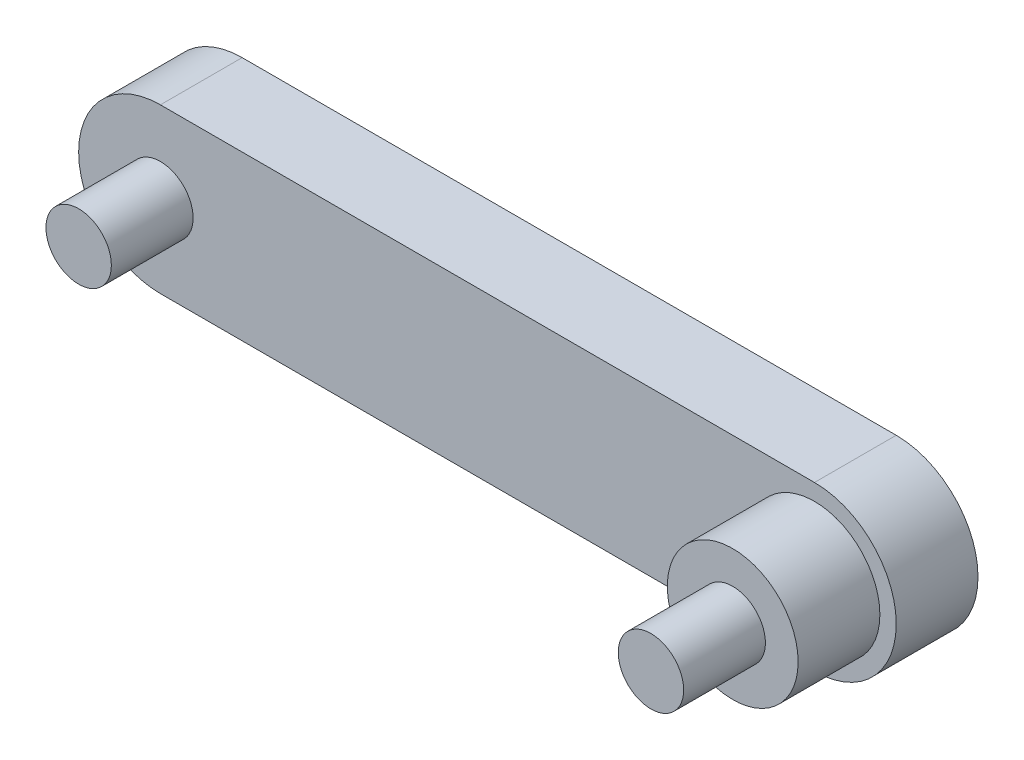
ISO-10303-21;
HEADER;
FILE_DESCRIPTION(('STEP AP214'),'2;1');
FILE_NAME('part.step','',(''),(''),'','','');
FILE_SCHEMA(('AUTOMOTIVE_DESIGN { 1 0 10303 214 1 1 1 1 }'));
ENDSEC;
DATA;
#1=APPLICATION_CONTEXT('core data for automotive mechanical design processes');
#2=APPLICATION_PROTOCOL_DEFINITION('international standard','automotive_design',2000,#1);
#3=PRODUCT_CONTEXT('',#1,'mechanical');
#4=PRODUCT('Part','Part','',(#3));
#5=PRODUCT_RELATED_PRODUCT_CATEGORY('part','',(#4));
#6=PRODUCT_DEFINITION_FORMATION('','',#4);
#7=PRODUCT_DEFINITION_CONTEXT('part definition',#1,'design');
#8=PRODUCT_DEFINITION('design','',#6,#7);
#9=PRODUCT_DEFINITION_SHAPE('','',#8);
#10=(LENGTH_UNIT() NAMED_UNIT(*) SI_UNIT(.MILLI.,.METRE.));
#11=(NAMED_UNIT(*) PLANE_ANGLE_UNIT() SI_UNIT($,.RADIAN.));
#12=(NAMED_UNIT(*) SI_UNIT($,.STERADIAN.) SOLID_ANGLE_UNIT());
#13=UNCERTAINTY_MEASURE_WITH_UNIT(LENGTH_MEASURE(1.E-05),#10,'distance_accuracy_value','');
#14=(GEOMETRIC_REPRESENTATION_CONTEXT(3) GLOBAL_UNCERTAINTY_ASSIGNED_CONTEXT((#13)) GLOBAL_UNIT_ASSIGNED_CONTEXT((#10,
#11,#12)) REPRESENTATION_CONTEXT('',''));
#15=CARTESIAN_POINT('',(0.,0.,0.));
#16=DIRECTION('',(0.,0.,1.));
#17=DIRECTION('',(1.,0.,0.));
#18=AXIS2_PLACEMENT_3D('',#15,#16,#17);
#19=CARTESIAN_POINT('',(-19.0852542993048,0.809523809523809,5.));
#20=DIRECTION('',(0.,0.,-1.));
#21=DIRECTION('',(-1.,0.,0.));
#22=AXIS2_PLACEMENT_3D('',#19,#20,#21);
#23=CYLINDRICAL_SURFACE('',#22,5.);
#24=CARTESIAN_POINT('',(-19.0852542993048,0.809523809523809,0.));
#25=DIRECTION('',(0.,0.,1.));
#26=DIRECTION('',(1.,0.,0.));
#27=AXIS2_PLACEMENT_3D('',#24,#25,#26);
#28=CIRCLE('',#27,5.);
#29=CARTESIAN_POINT('',(-19.0852542993048,5.80952380952381,0.));
#30=VERTEX_POINT('',#29);
#31=CARTESIAN_POINT('',(-19.0852542993048,-4.19047619047619,0.));
#32=VERTEX_POINT('',#31);
#33=EDGE_CURVE('E99',#30,#32,#28,.T.);
#34=ORIENTED_EDGE('',*,*,#33,.T.);
#35=DIRECTION('',(0.,0.,-1.));
#36=VECTOR('',#35,1.);
#37=CARTESIAN_POINT('',(-19.0852542993048,-4.19047619047619,5.));
#38=LINE('',#37,#36);
#39=CARTESIAN_POINT('',(-19.0852542993048,-4.19047619047619,5.));
#40=VERTEX_POINT('',#39);
#41=EDGE_CURVE('E36',#40,#32,#38,.T.);
#42=ORIENTED_EDGE('',*,*,#41,.F.);
#43=CARTESIAN_POINT('',(-19.0852542993048,0.809523809523809,5.));
#44=DIRECTION('',(0.,0.,1.));
#45=DIRECTION('',(1.,0.,0.));
#46=AXIS2_PLACEMENT_3D('',#43,#44,#45);
#47=CIRCLE('',#46,5.);
#48=CARTESIAN_POINT('',(-19.0852542993048,5.80952380952381,5.));
#49=VERTEX_POINT('',#48);
#50=EDGE_CURVE('E86',#49,#40,#47,.T.);
#51=ORIENTED_EDGE('',*,*,#50,.F.);
#52=DIRECTION('',(0.,0.,-1.));
#53=VECTOR('',#52,1.);
#54=CARTESIAN_POINT('',(-19.0852542993048,5.80952380952381,5.));
#55=LINE('',#54,#53);
#56=EDGE_CURVE('E95',#49,#30,#55,.T.);
#57=ORIENTED_EDGE('',*,*,#56,.T.);
#58=EDGE_LOOP('',(#34,#42,#51,#57));
#59=FACE_BOUND('',#58,.T.);
#60=ADVANCED_FACE('F33',(#59),#23,.T.);
#61=CARTESIAN_POINT('',(-19.0852542993048,-4.19047619047619,5.));
#62=DIRECTION('',(0.,1.,0.));
#63=DIRECTION('',(0.,0.,1.));
#64=AXIS2_PLACEMENT_3D('',#61,#62,#63);
#65=PLANE('',#64);
#66=DIRECTION('',(1.,0.,0.));
#67=VECTOR('',#66,1.);
#68=CARTESIAN_POINT('',(-19.0852542993048,-4.19047619047619,0.));
#69=LINE('',#68,#67);
#70=CARTESIAN_POINT('',(20.9147457006952,-4.19047619047619,0.));
#71=VERTEX_POINT('',#70);
#72=EDGE_CURVE('E91',#32,#71,#69,.T.);
#73=ORIENTED_EDGE('',*,*,#72,.T.);
#74=DIRECTION('',(0.,0.,-1.));
#75=VECTOR('',#74,1.);
#76=CARTESIAN_POINT('',(20.9147457006952,-4.19047619047619,5.));
#77=LINE('',#76,#75);
#78=CARTESIAN_POINT('',(20.9147457006952,-4.19047619047619,5.));
#79=VERTEX_POINT('',#78);
#80=EDGE_CURVE('E89',#79,#71,#77,.T.);
#81=ORIENTED_EDGE('',*,*,#80,.F.);
#82=DIRECTION('',(1.,0.,0.));
#83=VECTOR('',#82,1.);
#84=CARTESIAN_POINT('',(-19.0852542993048,-4.19047619047619,5.));
#85=LINE('',#84,#83);
#86=EDGE_CURVE('E81',#40,#79,#85,.T.);
#87=ORIENTED_EDGE('',*,*,#86,.F.);
#88=ORIENTED_EDGE('',*,*,#41,.T.);
#89=EDGE_LOOP('',(#73,#81,#87,#88));
#90=FACE_BOUND('',#89,.T.);
#91=ADVANCED_FACE('F90',(#90),#65,.F.);
#92=CARTESIAN_POINT('',(20.9147457006952,0.809523809523809,5.));
#93=DIRECTION('',(0.,0.,-1.));
#94=DIRECTION('',(-1.,0.,0.));
#95=AXIS2_PLACEMENT_3D('',#92,#93,#94);
#96=CYLINDRICAL_SURFACE('',#95,5.);
#97=CARTESIAN_POINT('',(20.9147457006952,0.809523809523809,0.));
#98=DIRECTION('',(0.,0.,1.));
#99=DIRECTION('',(1.,0.,0.));
#100=AXIS2_PLACEMENT_3D('',#97,#98,#99);
#101=CIRCLE('',#100,5.);
#102=CARTESIAN_POINT('',(20.9147457006952,5.80952380952381,0.));
#103=VERTEX_POINT('',#102);
#104=EDGE_CURVE('E67',#71,#103,#101,.T.);
#105=ORIENTED_EDGE('',*,*,#104,.T.);
#106=DIRECTION('',(0.,0.,-1.));
#107=VECTOR('',#106,1.);
#108=CARTESIAN_POINT('',(20.9147457006952,5.80952380952381,5.));
#109=LINE('',#108,#107);
#110=CARTESIAN_POINT('',(20.9147457006952,5.80952380952381,5.));
#111=VERTEX_POINT('',#110);
#112=EDGE_CURVE('E92',#111,#103,#109,.T.);
#113=ORIENTED_EDGE('',*,*,#112,.F.);
#114=CARTESIAN_POINT('',(20.9147457006952,0.809523809523809,5.));
#115=DIRECTION('',(0.,0.,1.));
#116=DIRECTION('',(1.,0.,0.));
#117=AXIS2_PLACEMENT_3D('',#114,#115,#116);
#118=CIRCLE('',#117,5.);
#119=EDGE_CURVE('E84',#79,#111,#118,.T.);
#120=ORIENTED_EDGE('',*,*,#119,.F.);
#121=ORIENTED_EDGE('',*,*,#80,.T.);
#122=EDGE_LOOP('',(#105,#113,#120,#121));
#123=FACE_BOUND('',#122,.T.);
#124=ADVANCED_FACE('F93',(#123),#96,.T.);
#125=CARTESIAN_POINT('',(-19.0852542993048,5.80952380952381,5.));
#126=DIRECTION('',(0.,-1.,0.));
#127=DIRECTION('',(0.,0.,-1.));
#128=AXIS2_PLACEMENT_3D('',#125,#126,#127);
#129=PLANE('',#128);
#130=DIRECTION('',(-1.,0.,0.));
#131=VECTOR('',#130,1.);
#132=CARTESIAN_POINT('',(-19.0852542993048,5.80952380952381,0.));
#133=LINE('',#132,#131);
#134=EDGE_CURVE('E73',#103,#30,#133,.T.);
#135=ORIENTED_EDGE('',*,*,#134,.T.);
#136=ORIENTED_EDGE('',*,*,#56,.F.);
#137=DIRECTION('',(-1.,0.,0.));
#138=VECTOR('',#137,1.);
#139=CARTESIAN_POINT('',(-19.0852542993048,5.80952380952381,5.));
#140=LINE('',#139,#138);
#141=EDGE_CURVE('E50',#111,#49,#140,.T.);
#142=ORIENTED_EDGE('',*,*,#141,.F.);
#143=ORIENTED_EDGE('',*,*,#112,.T.);
#144=EDGE_LOOP('',(#135,#136,#142,#143));
#145=FACE_BOUND('',#144,.T.);
#146=ADVANCED_FACE('F107',(#145),#129,.F.);
#147=CARTESIAN_POINT('',(-19.0852542993048,0.809523809523809,5.));
#148=DIRECTION('',(0.,0.,1.));
#149=DIRECTION('',(1.,0.,0.));
#150=AXIS2_PLACEMENT_3D('',#147,#148,#149);
#151=PLANE('',#150);
#152=CARTESIAN_POINT('',(20.9147457006952,0.809523809523809,5.));
#153=DIRECTION('',(0.,0.,1.));
#154=DIRECTION('',(1.,0.,0.));
#155=AXIS2_PLACEMENT_3D('',#152,#153,#154);
#156=CIRCLE('',#155,4.);
#157=CARTESIAN_POINT('',(24.9147457006952,0.809523809523809,5.));
#158=VERTEX_POINT('',#157);
#159=EDGE_CURVE('E119',#158,#158,#156,.T.);
#160=ORIENTED_EDGE('',*,*,#159,.F.);
#161=EDGE_LOOP('',(#160));
#162=FACE_BOUND('',#161,.T.);
#163=CARTESIAN_POINT('',(-19.0852542993048,0.809523809523809,5.));
#164=DIRECTION('',(0.,0.,1.));
#165=DIRECTION('',(1.,0.,0.));
#166=AXIS2_PLACEMENT_3D('',#163,#164,#165);
#167=CIRCLE('',#166,2.);
#168=CARTESIAN_POINT('',(-17.0852542993048,0.809523809523809,5.));
#169=VERTEX_POINT('',#168);
#170=EDGE_CURVE('E113',#169,#169,#167,.T.);
#171=ORIENTED_EDGE('',*,*,#170,.F.);
#172=EDGE_LOOP('',(#171));
#173=FACE_BOUND('',#172,.T.);
#174=ORIENTED_EDGE('',*,*,#50,.T.);
#175=ORIENTED_EDGE('',*,*,#86,.T.);
#176=ORIENTED_EDGE('',*,*,#119,.T.);
#177=ORIENTED_EDGE('',*,*,#141,.T.);
#178=EDGE_LOOP('',(#174,#175,#176,#177));
#179=FACE_BOUND('',#178,.T.);
#180=ADVANCED_FACE('F82',(#162,#173,#179),#151,.T.);
#181=CARTESIAN_POINT('',(-19.0852542993048,0.809523809523809,0.));
#182=DIRECTION('',(0.,0.,1.));
#183=DIRECTION('',(1.,0.,0.));
#184=AXIS2_PLACEMENT_3D('',#181,#182,#183);
#185=PLANE('',#184);
#186=ORIENTED_EDGE('',*,*,#33,.F.);
#187=ORIENTED_EDGE('',*,*,#134,.F.);
#188=ORIENTED_EDGE('',*,*,#104,.F.);
#189=ORIENTED_EDGE('',*,*,#72,.F.);
#190=EDGE_LOOP('',(#186,#187,#188,#189));
#191=FACE_BOUND('',#190,.T.);
#192=ADVANCED_FACE('F110',(#191),#185,.F.);
#193=CARTESIAN_POINT('',(-19.0852542993048,0.809523809523809,10.));
#194=DIRECTION('',(0.,0.,-1.));
#195=DIRECTION('',(-1.,0.,0.));
#196=AXIS2_PLACEMENT_3D('',#193,#194,#195);
#197=CYLINDRICAL_SURFACE('',#196,2.);
#198=CARTESIAN_POINT('',(-19.0852542993048,0.809523809523809,10.));
#199=DIRECTION('',(0.,0.,1.));
#200=DIRECTION('',(1.,0.,0.));
#201=AXIS2_PLACEMENT_3D('',#198,#199,#200);
#202=CIRCLE('',#201,2.);
#203=CARTESIAN_POINT('',(-17.0852542993048,0.809523809523809,10.));
#204=VERTEX_POINT('',#203);
#205=EDGE_CURVE('E102',#204,#204,#202,.T.);
#206=ORIENTED_EDGE('',*,*,#205,.F.);
#207=EDGE_LOOP('',(#206));
#208=FACE_BOUND('',#207,.T.);
#209=ORIENTED_EDGE('',*,*,#170,.T.);
#210=EDGE_LOOP('',(#209));
#211=FACE_BOUND('',#210,.T.);
#212=ADVANCED_FACE('F154',(#208,#211),#197,.T.);
#213=CARTESIAN_POINT('',(-19.0852542993048,0.809523809523809,10.));
#214=DIRECTION('',(0.,0.,1.));
#215=DIRECTION('',(1.,0.,0.));
#216=AXIS2_PLACEMENT_3D('',#213,#214,#215);
#217=PLANE('',#216);
#218=ORIENTED_EDGE('',*,*,#205,.T.);
#219=EDGE_LOOP('',(#218));
#220=FACE_BOUND('',#219,.T.);
#221=ADVANCED_FACE('F145',(#220),#217,.T.);
#222=CARTESIAN_POINT('',(20.9147457006952,0.809523809523809,10.));
#223=DIRECTION('',(0.,0.,-1.));
#224=DIRECTION('',(-1.,0.,0.));
#225=AXIS2_PLACEMENT_3D('',#222,#223,#224);
#226=CYLINDRICAL_SURFACE('',#225,4.);
#227=CARTESIAN_POINT('',(20.9147457006952,0.809523809523809,10.));
#228=DIRECTION('',(0.,0.,1.));
#229=DIRECTION('',(1.,0.,0.));
#230=AXIS2_PLACEMENT_3D('',#227,#228,#229);
#231=CIRCLE('',#230,4.);
#232=CARTESIAN_POINT('',(24.9147457006952,0.809523809523809,10.));
#233=VERTEX_POINT('',#232);
#234=EDGE_CURVE('E116',#233,#233,#231,.T.);
#235=ORIENTED_EDGE('',*,*,#234,.F.);
#236=EDGE_LOOP('',(#235));
#237=FACE_BOUND('',#236,.T.);
#238=ORIENTED_EDGE('',*,*,#159,.T.);
#239=EDGE_LOOP('',(#238));
#240=FACE_BOUND('',#239,.T.);
#241=ADVANCED_FACE('F139',(#237,#240),#226,.T.);
#242=CARTESIAN_POINT('',(20.9147457006952,0.809523809523809,10.));
#243=DIRECTION('',(0.,0.,1.));
#244=DIRECTION('',(1.,0.,0.));
#245=AXIS2_PLACEMENT_3D('',#242,#243,#244);
#246=PLANE('',#245);
#247=CARTESIAN_POINT('',(20.9147457006952,0.809523809523809,10.));
#248=DIRECTION('',(0.,0.,1.));
#249=DIRECTION('',(1.,0.,0.));
#250=AXIS2_PLACEMENT_3D('',#247,#248,#249);
#251=CIRCLE('',#250,2.);
#252=CARTESIAN_POINT('',(22.9147457006952,0.809523809523809,10.));
#253=VERTEX_POINT('',#252);
#254=EDGE_CURVE('E11',#253,#253,#251,.T.);
#255=ORIENTED_EDGE('',*,*,#254,.F.);
#256=EDGE_LOOP('',(#255));
#257=FACE_BOUND('',#256,.T.);
#258=ORIENTED_EDGE('',*,*,#234,.T.);
#259=EDGE_LOOP('',(#258));
#260=FACE_BOUND('',#259,.T.);
#261=ADVANCED_FACE('F133',(#257,#260),#246,.T.);
#262=CARTESIAN_POINT('',(20.9147457006952,0.809523809523809,15.));
#263=DIRECTION('',(0.,0.,-1.));
#264=DIRECTION('',(-1.,0.,0.));
#265=AXIS2_PLACEMENT_3D('',#262,#263,#264);
#266=CYLINDRICAL_SURFACE('',#265,2.);
#267=CARTESIAN_POINT('',(20.9147457006952,0.809523809523809,15.));
#268=DIRECTION('',(0.,0.,1.));
#269=DIRECTION('',(1.,0.,0.));
#270=AXIS2_PLACEMENT_3D('',#267,#268,#269);
#271=CIRCLE('',#270,2.);
#272=CARTESIAN_POINT('',(22.9147457006952,0.809523809523809,15.));
#273=VERTEX_POINT('',#272);
#274=EDGE_CURVE('E122',#273,#273,#271,.T.);
#275=ORIENTED_EDGE('',*,*,#274,.F.);
#276=EDGE_LOOP('',(#275));
#277=FACE_BOUND('',#276,.T.);
#278=ORIENTED_EDGE('',*,*,#254,.T.);
#279=EDGE_LOOP('',(#278));
#280=FACE_BOUND('',#279,.T.);
#281=ADVANCED_FACE('F130',(#277,#280),#266,.T.);
#282=CARTESIAN_POINT('',(20.9147457006952,0.809523809523809,15.));
#283=DIRECTION('',(0.,0.,1.));
#284=DIRECTION('',(1.,0.,0.));
#285=AXIS2_PLACEMENT_3D('',#282,#283,#284);
#286=PLANE('',#285);
#287=ORIENTED_EDGE('',*,*,#274,.T.);
#288=EDGE_LOOP('',(#287));
#289=FACE_BOUND('',#288,.T.);
#290=ADVANCED_FACE('F128',(#289),#286,.T.);
#291=CLOSED_SHELL('',(#60,#91,#124,#146,#180,#192,#212,#221,#241,#261,#281,#290));
#292=MANIFOLD_SOLID_BREP('B2',#291);
#293=ADVANCED_BREP_SHAPE_REPRESENTATION('',(#18,#292),#14);
#294=SHAPE_DEFINITION_REPRESENTATION(#9,#293);
ENDSEC;
END-ISO-10303-21;
